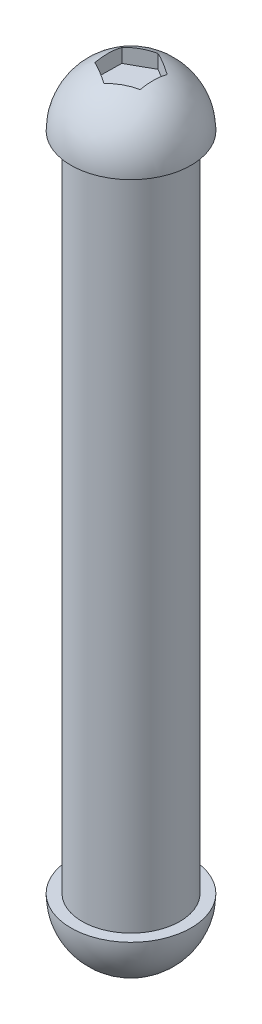
ISO-10303-21;
HEADER;
FILE_DESCRIPTION(('STEP AP214'),'2;1');
FILE_NAME('part.step','',(''),(''),'','','');
FILE_SCHEMA(('AUTOMOTIVE_DESIGN { 1 0 10303 214 1 1 1 1 }'));
ENDSEC;
DATA;
#1=APPLICATION_CONTEXT('core data for automotive mechanical design processes');
#2=APPLICATION_PROTOCOL_DEFINITION('international standard','automotive_design',2000,#1);
#3=PRODUCT_CONTEXT('',#1,'mechanical');
#4=PRODUCT('Part','Part','',(#3));
#5=PRODUCT_RELATED_PRODUCT_CATEGORY('part','',(#4));
#6=PRODUCT_DEFINITION_FORMATION('','',#4);
#7=PRODUCT_DEFINITION_CONTEXT('part definition',#1,'design');
#8=PRODUCT_DEFINITION('design','',#6,#7);
#9=PRODUCT_DEFINITION_SHAPE('','',#8);
#10=(LENGTH_UNIT() NAMED_UNIT(*) SI_UNIT(.MILLI.,.METRE.));
#11=(NAMED_UNIT(*) PLANE_ANGLE_UNIT() SI_UNIT($,.RADIAN.));
#12=(NAMED_UNIT(*) SI_UNIT($,.STERADIAN.) SOLID_ANGLE_UNIT());
#13=UNCERTAINTY_MEASURE_WITH_UNIT(LENGTH_MEASURE(1.E-05),#10,'distance_accuracy_value','');
#14=(GEOMETRIC_REPRESENTATION_CONTEXT(3) GLOBAL_UNCERTAINTY_ASSIGNED_CONTEXT((#13)) GLOBAL_UNIT_ASSIGNED_CONTEXT((#10,
#11,#12)) REPRESENTATION_CONTEXT('',''));
#15=CARTESIAN_POINT('',(0.,0.,0.));
#16=DIRECTION('',(0.,0.,1.));
#17=DIRECTION('',(1.,0.,0.));
#18=AXIS2_PLACEMENT_3D('',#15,#16,#17);
#19=CARTESIAN_POINT('',(0.,0.,0.));
#20=DIRECTION('',(0.0757388786567332,0.,-0.997127686036157));
#21=DIRECTION('',(-0.997127686036157,0.,-0.0757388786567332));
#22=AXIS2_PLACEMENT_3D('',#19,#20,#21);
#23=SPHERICAL_SURFACE('',#22,3.);
#24=CARTESIAN_POINT('',(-0.591036564901015,0.,0.987830611369554));
#25=DIRECTION('',(-0.513433884385675,0.,0.858129154827312));
#26=DIRECTION('',(0.858129154827312,0.,0.513433884385675));
#27=AXIS2_PLACEMENT_3D('',#24,#25,#26);
#28=CIRCLE('',#27,2.77035493433446);
#29=CARTESIAN_POINT('',(-0.0207122955130502,-2.68945259912156,1.32906573121607));
#30=VERTEX_POINT('',#29);
#31=CARTESIAN_POINT('',(-1.16136083428898,-2.68945259912156,0.646595491523041));
#32=VERTEX_POINT('',#31);
#33=EDGE_CURVE('E48',#30,#32,#28,.F.);
#34=ORIENTED_EDGE('',*,*,#33,.F.);
#35=CARTESIAN_POINT('',(0.559968121631439,0.,1.00576798545455));
#36=DIRECTION('',(0.486444705615685,0.,0.873711364455373));
#37=DIRECTION('',(0.873711364455373,0.,-0.486444705615685));
#38=AXIS2_PLACEMENT_3D('',#35,#36,#37);
#39=CIRCLE('',#38,2.77035493433446);
#40=CARTESIAN_POINT('',(1.14064853877593,-2.68945259912156,0.682470239693026));
#41=VERTEX_POINT('',#40);
#42=EDGE_CURVE('E63',#41,#30,#39,.F.);
#43=ORIENTED_EDGE('',*,*,#42,.F.);
#44=CARTESIAN_POINT('',(1.15100468653246,0.,0.0179373740849928));
#45=DIRECTION('',(0.99987859000136,0.,0.0155822096280604));
#46=DIRECTION('',(0.0155822096280604,0.,-0.99987859000136));
#47=AXIS2_PLACEMENT_3D('',#44,#45,#46);
#48=CIRCLE('',#47,2.77035493433446);
#49=CARTESIAN_POINT('',(1.16136083428898,-2.68945259912156,-0.646595491523042));
#50=VERTEX_POINT('',#49);
#51=EDGE_CURVE('E233',#50,#41,#48,.F.);
#52=ORIENTED_EDGE('',*,*,#51,.F.);
#53=CARTESIAN_POINT('',(0.591036564901016,0.,-0.987830611369555));
#54=DIRECTION('',(0.513433884385675,0.,-0.858129154827312));
#55=DIRECTION('',(-0.858129154827312,0.,-0.513433884385675));
#56=AXIS2_PLACEMENT_3D('',#53,#54,#55);
#57=CIRCLE('',#56,2.77035493433446);
#58=CARTESIAN_POINT('',(0.0207122955130501,-2.68945259912156,-1.32906573121607));
#59=VERTEX_POINT('',#58);
#60=EDGE_CURVE('E231',#59,#50,#57,.F.);
#61=ORIENTED_EDGE('',*,*,#60,.F.);
#62=CARTESIAN_POINT('',(-0.559968121631441,0.,-1.00576798545455));
#63=DIRECTION('',(-0.486444705615685,0.,-0.873711364455373));
#64=DIRECTION('',(-0.873711364455373,0.,0.486444705615685));
#65=AXIS2_PLACEMENT_3D('',#62,#63,#64);
#66=CIRCLE('',#65,2.77035493433446);
#67=CARTESIAN_POINT('',(-1.14064853877593,-2.68945259912156,-0.682470239693026));
#68=VERTEX_POINT('',#67);
#69=EDGE_CURVE('E229',#68,#59,#66,.F.);
#70=ORIENTED_EDGE('',*,*,#69,.F.);
#71=CARTESIAN_POINT('',(-1.15100468653246,0.,-0.0179373740849914));
#72=DIRECTION('',(-0.99987859000136,0.,-0.0155822096280607));
#73=DIRECTION('',(-0.0155822096280607,0.,0.99987859000136));
#74=AXIS2_PLACEMENT_3D('',#71,#72,#73);
#75=CIRCLE('',#74,2.77035493433446);
#76=EDGE_CURVE('E227',#32,#68,#75,.F.);
#77=ORIENTED_EDGE('',*,*,#76,.F.);
#78=EDGE_LOOP('',(#34,#43,#52,#61,#70,#77));
#79=FACE_BOUND('',#78,.T.);
#80=CARTESIAN_POINT('',(0.,0.,0.));
#81=DIRECTION('',(0.,-1.,0.));
#82=DIRECTION('',(-0.151042665635923,0.,0.988527244519642));
#83=AXIS2_PLACEMENT_3D('',#80,#81,#82);
#84=CIRCLE('',#83,3.);
#85=CARTESIAN_POINT('',(-0.45312799690777,0.,2.96558173355893));
#86=VERTEX_POINT('',#85);
#87=EDGE_CURVE('E212',#86,#86,#84,.T.);
#88=ORIENTED_EDGE('',*,*,#87,.T.);
#89=EDGE_LOOP('',(#88));
#90=FACE_BOUND('',#89,.T.);
#91=ADVANCED_FACE('F41',(#79,#90),#23,.T.);
#92=CARTESIAN_POINT('',(0.,0.,0.));
#93=DIRECTION('',(0.,-1.,0.));
#94=DIRECTION('',(-0.151042665635923,0.,0.988527244519642));
#95=AXIS2_PLACEMENT_3D('',#92,#93,#94);
#96=PLANE('',#95);
#97=CARTESIAN_POINT('',(0.,0.,0.));
#98=DIRECTION('',(0.,-1.,0.));
#99=DIRECTION('',(1.,0.,0.));
#100=AXIS2_PLACEMENT_3D('',#97,#98,#99);
#101=CIRCLE('',#100,2.44);
#102=CARTESIAN_POINT('',(2.44,0.,0.));
#103=VERTEX_POINT('',#102);
#104=EDGE_CURVE('E11',#103,#103,#101,.F.);
#105=ORIENTED_EDGE('',*,*,#104,.F.);
#106=EDGE_LOOP('',(#105));
#107=FACE_BOUND('',#106,.T.);
#108=ORIENTED_EDGE('',*,*,#87,.F.);
#109=EDGE_LOOP('',(#108));
#110=FACE_BOUND('',#109,.T.);
#111=ADVANCED_FACE('F268',(#107,#110),#96,.F.);
#112=CARTESIAN_POINT('',(-0.0207122955130502,-2.,1.32906573121607));
#113=DIRECTION('',(-0.513433884385675,0.,0.858129154827312));
#114=DIRECTION('',(0.858129154827312,0.,0.513433884385675));
#115=AXIS2_PLACEMENT_3D('',#112,#113,#114);
#116=PLANE('',#115);
#117=ORIENTED_EDGE('',*,*,#33,.T.);
#118=DIRECTION('',(0.,-1.,0.));
#119=VECTOR('',#118,1.);
#120=CARTESIAN_POINT('',(-1.16136083428898,-2.,0.646595491523041));
#121=LINE('',#120,#119);
#122=CARTESIAN_POINT('',(-1.16136083428898,-2.,0.646595491523041));
#123=VERTEX_POINT('',#122);
#124=EDGE_CURVE('E55',#123,#32,#121,.T.);
#125=ORIENTED_EDGE('',*,*,#124,.F.);
#126=DIRECTION('',(-0.858129154827312,0.,-0.513433884385675));
#127=VECTOR('',#126,1.);
#128=CARTESIAN_POINT('',(-0.0207122955130502,-2.,1.32906573121607));
#129=LINE('',#128,#127);
#130=CARTESIAN_POINT('',(-0.0207122955130502,-2.,1.32906573121607));
#131=VERTEX_POINT('',#130);
#132=EDGE_CURVE('E192',#131,#123,#129,.T.);
#133=ORIENTED_EDGE('',*,*,#132,.F.);
#134=DIRECTION('',(0.,-1.,0.));
#135=VECTOR('',#134,1.);
#136=CARTESIAN_POINT('',(-0.0207122955130502,-2.,1.32906573121607));
#137=LINE('',#136,#135);
#138=EDGE_CURVE('E210',#131,#30,#137,.T.);
#139=ORIENTED_EDGE('',*,*,#138,.T.);
#140=EDGE_LOOP('',(#117,#125,#133,#139));
#141=FACE_BOUND('',#140,.T.);
#142=ADVANCED_FACE('F238',(#141),#116,.F.);
#143=CARTESIAN_POINT('',(1.14064853877593,-2.,0.682470239693025));
#144=DIRECTION('',(0.486444705615685,0.,0.873711364455373));
#145=DIRECTION('',(0.873711364455373,0.,-0.486444705615685));
#146=AXIS2_PLACEMENT_3D('',#143,#144,#145);
#147=PLANE('',#146);
#148=ORIENTED_EDGE('',*,*,#42,.T.);
#149=ORIENTED_EDGE('',*,*,#138,.F.);
#150=DIRECTION('',(-0.873711364455373,0.,0.486444705615685));
#151=VECTOR('',#150,1.);
#152=CARTESIAN_POINT('',(1.14064853877593,-2.,0.682470239693025));
#153=LINE('',#152,#151);
#154=CARTESIAN_POINT('',(1.14064853877593,-2.,0.682470239693025));
#155=VERTEX_POINT('',#154);
#156=EDGE_CURVE('E207',#155,#131,#153,.T.);
#157=ORIENTED_EDGE('',*,*,#156,.F.);
#158=DIRECTION('',(0.,-1.,0.));
#159=VECTOR('',#158,1.);
#160=CARTESIAN_POINT('',(1.14064853877593,-2.,0.682470239693025));
#161=LINE('',#160,#159);
#162=EDGE_CURVE('E213',#155,#41,#161,.T.);
#163=ORIENTED_EDGE('',*,*,#162,.T.);
#164=EDGE_LOOP('',(#148,#149,#157,#163));
#165=FACE_BOUND('',#164,.T.);
#166=ADVANCED_FACE('F253',(#165),#147,.F.);
#167=CARTESIAN_POINT('',(1.16136083428898,-2.,-0.646595491523042));
#168=DIRECTION('',(0.99987859000136,0.,0.0155822096280604));
#169=DIRECTION('',(0.0155822096280604,0.,-0.99987859000136));
#170=AXIS2_PLACEMENT_3D('',#167,#168,#169);
#171=PLANE('',#170);
#172=ORIENTED_EDGE('',*,*,#51,.T.);
#173=ORIENTED_EDGE('',*,*,#162,.F.);
#174=DIRECTION('',(-0.0155822096280604,0.,0.99987859000136));
#175=VECTOR('',#174,1.);
#176=CARTESIAN_POINT('',(1.16136083428898,-2.,-0.646595491523042));
#177=LINE('',#176,#175);
#178=CARTESIAN_POINT('',(1.16136083428898,-2.,-0.646595491523042));
#179=VERTEX_POINT('',#178);
#180=EDGE_CURVE('E204',#179,#155,#177,.T.);
#181=ORIENTED_EDGE('',*,*,#180,.F.);
#182=DIRECTION('',(0.,-1.,0.));
#183=VECTOR('',#182,1.);
#184=CARTESIAN_POINT('',(1.16136083428898,-2.,-0.646595491523042));
#185=LINE('',#184,#183);
#186=EDGE_CURVE('E215',#179,#50,#185,.T.);
#187=ORIENTED_EDGE('',*,*,#186,.T.);
#188=EDGE_LOOP('',(#172,#173,#181,#187));
#189=FACE_BOUND('',#188,.T.);
#190=ADVANCED_FACE('F256',(#189),#171,.F.);
#191=CARTESIAN_POINT('',(0.0207122955130502,-2.,-1.32906573121607));
#192=DIRECTION('',(0.513433884385675,0.,-0.858129154827312));
#193=DIRECTION('',(-0.858129154827312,0.,-0.513433884385675));
#194=AXIS2_PLACEMENT_3D('',#191,#192,#193);
#195=PLANE('',#194);
#196=ORIENTED_EDGE('',*,*,#60,.T.);
#197=ORIENTED_EDGE('',*,*,#186,.F.);
#198=DIRECTION('',(0.858129154827312,0.,0.513433884385675));
#199=VECTOR('',#198,1.);
#200=CARTESIAN_POINT('',(0.0207122955130502,-2.,-1.32906573121607));
#201=LINE('',#200,#199);
#202=CARTESIAN_POINT('',(0.0207122955130502,-2.,-1.32906573121607));
#203=VERTEX_POINT('',#202);
#204=EDGE_CURVE('E201',#203,#179,#201,.T.);
#205=ORIENTED_EDGE('',*,*,#204,.F.);
#206=DIRECTION('',(0.,-1.,0.));
#207=VECTOR('',#206,1.);
#208=CARTESIAN_POINT('',(0.0207122955130502,-2.,-1.32906573121607));
#209=LINE('',#208,#207);
#210=EDGE_CURVE('E218',#203,#59,#209,.T.);
#211=ORIENTED_EDGE('',*,*,#210,.T.);
#212=EDGE_LOOP('',(#196,#197,#205,#211));
#213=FACE_BOUND('',#212,.T.);
#214=ADVANCED_FACE('F258',(#213),#195,.F.);
#215=CARTESIAN_POINT('',(-1.14064853877593,-2.,-0.682470239693026));
#216=DIRECTION('',(-0.486444705615685,0.,-0.873711364455373));
#217=DIRECTION('',(-0.873711364455373,0.,0.486444705615685));
#218=AXIS2_PLACEMENT_3D('',#215,#216,#217);
#219=PLANE('',#218);
#220=ORIENTED_EDGE('',*,*,#69,.T.);
#221=ORIENTED_EDGE('',*,*,#210,.F.);
#222=DIRECTION('',(0.873711364455373,0.,-0.486444705615685));
#223=VECTOR('',#222,1.);
#224=CARTESIAN_POINT('',(-1.14064853877593,-2.,-0.682470239693026));
#225=LINE('',#224,#223);
#226=CARTESIAN_POINT('',(-1.14064853877593,-2.,-0.682470239693026));
#227=VERTEX_POINT('',#226);
#228=EDGE_CURVE('E198',#227,#203,#225,.T.);
#229=ORIENTED_EDGE('',*,*,#228,.F.);
#230=DIRECTION('',(0.,-1.,0.));
#231=VECTOR('',#230,1.);
#232=CARTESIAN_POINT('',(-1.14064853877593,-2.,-0.682470239693026));
#233=LINE('',#232,#231);
#234=EDGE_CURVE('E221',#227,#68,#233,.T.);
#235=ORIENTED_EDGE('',*,*,#234,.T.);
#236=EDGE_LOOP('',(#220,#221,#229,#235));
#237=FACE_BOUND('',#236,.T.);
#238=ADVANCED_FACE('F247',(#237),#219,.F.);
#239=CARTESIAN_POINT('',(-1.16136083428898,-2.,0.646595491523041));
#240=DIRECTION('',(-0.99987859000136,0.,-0.0155822096280607));
#241=DIRECTION('',(-0.0155822096280607,0.,0.99987859000136));
#242=AXIS2_PLACEMENT_3D('',#239,#240,#241);
#243=PLANE('',#242);
#244=ORIENTED_EDGE('',*,*,#76,.T.);
#245=ORIENTED_EDGE('',*,*,#234,.F.);
#246=DIRECTION('',(0.0155822096280607,0.,-0.99987859000136));
#247=VECTOR('',#246,1.);
#248=CARTESIAN_POINT('',(-1.16136083428898,-2.,0.646595491523041));
#249=LINE('',#248,#247);
#250=EDGE_CURVE('E195',#123,#227,#249,.T.);
#251=ORIENTED_EDGE('',*,*,#250,.F.);
#252=ORIENTED_EDGE('',*,*,#124,.T.);
#253=EDGE_LOOP('',(#244,#245,#251,#252));
#254=FACE_BOUND('',#253,.T.);
#255=ADVANCED_FACE('F244',(#254),#243,.F.);
#256=CARTESIAN_POINT('',(0.,-2.,0.));
#257=DIRECTION('',(0.,-1.,0.));
#258=DIRECTION('',(0.,0.,-1.));
#259=AXIS2_PLACEMENT_3D('',#256,#257,#258);
#260=PLANE('',#259);
#261=ORIENTED_EDGE('',*,*,#132,.T.);
#262=ORIENTED_EDGE('',*,*,#250,.T.);
#263=ORIENTED_EDGE('',*,*,#228,.T.);
#264=ORIENTED_EDGE('',*,*,#204,.T.);
#265=ORIENTED_EDGE('',*,*,#180,.T.);
#266=ORIENTED_EDGE('',*,*,#156,.T.);
#267=EDGE_LOOP('',(#261,#262,#263,#264,#265,#266));
#268=FACE_BOUND('',#267,.T.);
#269=ADVANCED_FACE('F250',(#268),#260,.T.);
#270=CARTESIAN_POINT('',(-1.1488793937189E-13,16.5,0.));
#271=DIRECTION('',(0.,-1.,0.));
#272=DIRECTION('',(1.,0.,0.));
#273=AXIS2_PLACEMENT_3D('',#270,#271,#272);
#274=CYLINDRICAL_SURFACE('',#273,2.44);
#275=ORIENTED_EDGE('',*,*,#104,.T.);
#276=EDGE_LOOP('',(#275));
#277=FACE_BOUND('',#276,.T.);
#278=CARTESIAN_POINT('',(-2.29775878743779E-13,33.,0.));
#279=DIRECTION('',(0.,-1.,0.));
#280=DIRECTION('',(1.,0.,0.));
#281=AXIS2_PLACEMENT_3D('',#278,#279,#280);
#282=CIRCLE('',#281,2.44);
#283=CARTESIAN_POINT('',(2.43999999999977,33.,0.));
#284=VERTEX_POINT('',#283);
#285=EDGE_CURVE('E189',#284,#284,#282,.F.);
#286=ORIENTED_EDGE('',*,*,#285,.F.);
#287=EDGE_LOOP('',(#286));
#288=FACE_BOUND('',#287,.T.);
#289=ADVANCED_FACE('F284',(#277,#288),#274,.T.);
#290=CARTESIAN_POINT('',(-2.29884298961028E-13,33.,0.));
#291=DIRECTION('',(0.0757388786567332,0.,-0.997127686036157));
#292=DIRECTION('',(-0.997127686036157,0.,-0.0757388786567332));
#293=AXIS2_PLACEMENT_3D('',#290,#291,#292);
#294=SPHERICAL_SURFACE('',#293,3.);
#295=CARTESIAN_POINT('',(-0.591036564901245,33.,0.987830611369537));
#296=DIRECTION('',(0.513433884385675,0.,-0.858129154827312));
#297=DIRECTION('',(0.858129154827312,0.,0.513433884385675));
#298=AXIS2_PLACEMENT_3D('',#295,#296,#297);
#299=CIRCLE('',#298,2.77035493433446);
#300=CARTESIAN_POINT('',(-0.0207122955133174,35.6894525991216,1.32906573121605));
#301=VERTEX_POINT('',#300);
#302=CARTESIAN_POINT('',(-1.16136083428925,35.6894525991215,0.646595491523021));
#303=VERTEX_POINT('',#302);
#304=EDGE_CURVE('E187',#301,#303,#299,.F.);
#305=ORIENTED_EDGE('',*,*,#304,.T.);
#306=CARTESIAN_POINT('',(-1.15100468653269,33.,-0.0179373740850089));
#307=DIRECTION('',(0.99987859000136,0.,0.0155822096280607));
#308=DIRECTION('',(-0.0155822096280607,0.,0.99987859000136));
#309=AXIS2_PLACEMENT_3D('',#306,#307,#308);
#310=CIRCLE('',#309,2.77035493433446);
#311=CARTESIAN_POINT('',(-1.1406485387762,35.6894525991215,-0.682470239693047));
#312=VERTEX_POINT('',#311);
#313=EDGE_CURVE('E146',#303,#312,#310,.F.);
#314=ORIENTED_EDGE('',*,*,#313,.T.);
#315=CARTESIAN_POINT('',(-0.559968121631671,33.,-1.00576798545456));
#316=DIRECTION('',(0.486444705615685,0.,0.873711364455373));
#317=DIRECTION('',(-0.873711364455373,0.,0.486444705615685));
#318=AXIS2_PLACEMENT_3D('',#315,#316,#317);
#319=CIRCLE('',#318,2.77035493433446);
#320=CARTESIAN_POINT('',(0.0207122955127829,35.6894525991216,-1.32906573121609));
#321=VERTEX_POINT('',#320);
#322=EDGE_CURVE('E175',#312,#321,#319,.F.);
#323=ORIENTED_EDGE('',*,*,#322,.T.);
#324=CARTESIAN_POINT('',(0.591036564900786,33.,-0.987830611369572));
#325=DIRECTION('',(-0.513433884385675,0.,0.858129154827312));
#326=DIRECTION('',(-0.858129154827312,0.,-0.513433884385675));
#327=AXIS2_PLACEMENT_3D('',#324,#325,#326);
#328=CIRCLE('',#327,2.77035493433446);
#329=CARTESIAN_POINT('',(1.16136083428871,35.6894525991216,-0.646595491523062));
#330=VERTEX_POINT('',#329);
#331=EDGE_CURVE('E178',#321,#330,#328,.F.);
#332=ORIENTED_EDGE('',*,*,#331,.T.);
#333=CARTESIAN_POINT('',(1.15100468653223,33.,0.0179373740849753));
#334=DIRECTION('',(-0.99987859000136,0.,-0.0155822096280604));
#335=DIRECTION('',(0.0155822096280604,0.,-0.99987859000136));
#336=AXIS2_PLACEMENT_3D('',#333,#334,#335);
#337=CIRCLE('',#336,2.77035493433446);
#338=CARTESIAN_POINT('',(1.14064853877566,35.6894525991216,0.682470239693005));
#339=VERTEX_POINT('',#338);
#340=EDGE_CURVE('E181',#330,#339,#337,.F.);
#341=ORIENTED_EDGE('',*,*,#340,.T.);
#342=CARTESIAN_POINT('',(0.55996812163121,33.,1.00576798545453));
#343=DIRECTION('',(-0.486444705615685,0.,-0.873711364455373));
#344=DIRECTION('',(0.873711364455373,0.,-0.486444705615685));
#345=AXIS2_PLACEMENT_3D('',#342,#343,#344);
#346=CIRCLE('',#345,2.77035493433446);
#347=EDGE_CURVE('E184',#339,#301,#346,.F.);
#348=ORIENTED_EDGE('',*,*,#347,.T.);
#349=EDGE_LOOP('',(#305,#314,#323,#332,#341,#348));
#350=FACE_BOUND('',#349,.T.);
#351=CARTESIAN_POINT('',(-2.29884298961028E-13,33.,0.));
#352=DIRECTION('',(0.,-1.,0.));
#353=DIRECTION('',(-0.151042665635923,0.,0.988527244519642));
#354=AXIS2_PLACEMENT_3D('',#351,#352,#353);
#355=CIRCLE('',#354,3.);
#356=CARTESIAN_POINT('',(-0.453127996908,33.,2.96558173355891));
#357=VERTEX_POINT('',#356);
#358=EDGE_CURVE('E164',#357,#357,#355,.T.);
#359=ORIENTED_EDGE('',*,*,#358,.F.);
#360=EDGE_LOOP('',(#359));
#361=FACE_BOUND('',#360,.T.);
#362=ADVANCED_FACE('F289',(#350,#361),#294,.T.);
#363=CARTESIAN_POINT('',(-2.29884298961028E-13,33.,0.));
#364=DIRECTION('',(0.,1.,0.));
#365=DIRECTION('',(-0.151042665635923,0.,0.988527244519642));
#366=AXIS2_PLACEMENT_3D('',#363,#364,#365);
#367=PLANE('',#366);
#368=ORIENTED_EDGE('',*,*,#285,.T.);
#369=EDGE_LOOP('',(#368));
#370=FACE_BOUND('',#369,.T.);
#371=ORIENTED_EDGE('',*,*,#358,.T.);
#372=EDGE_LOOP('',(#371));
#373=FACE_BOUND('',#372,.T.);
#374=ADVANCED_FACE('F356',(#370,#373),#367,.F.);
#375=CARTESIAN_POINT('',(-0.0207122955133078,35.,1.32906573121605));
#376=DIRECTION('',(-0.513433884385675,0.,0.858129154827312));
#377=DIRECTION('',(0.858129154827312,0.,0.513433884385675));
#378=AXIS2_PLACEMENT_3D('',#375,#376,#377);
#379=PLANE('',#378);
#380=ORIENTED_EDGE('',*,*,#304,.F.);
#381=DIRECTION('',(0.,1.,0.));
#382=VECTOR('',#381,1.);
#383=CARTESIAN_POINT('',(-0.0207122955133078,35.,1.32906573121605));
#384=LINE('',#383,#382);
#385=CARTESIAN_POINT('',(-0.0207122955133078,35.,1.32906573121605));
#386=VERTEX_POINT('',#385);
#387=EDGE_CURVE('E154',#386,#301,#384,.T.);
#388=ORIENTED_EDGE('',*,*,#387,.F.);
#389=DIRECTION('',(-0.858129154827312,0.,-0.513433884385675));
#390=VECTOR('',#389,1.);
#391=CARTESIAN_POINT('',(-0.0207122955133078,35.,1.32906573121605));
#392=LINE('',#391,#390);
#393=CARTESIAN_POINT('',(-1.16136083428924,35.,0.646595491523021));
#394=VERTEX_POINT('',#393);
#395=EDGE_CURVE('E135',#386,#394,#392,.T.);
#396=ORIENTED_EDGE('',*,*,#395,.T.);
#397=DIRECTION('',(0.,1.,0.));
#398=VECTOR('',#397,1.);
#399=CARTESIAN_POINT('',(-1.16136083428924,35.,0.646595491523021));
#400=LINE('',#399,#398);
#401=EDGE_CURVE('E143',#394,#303,#400,.T.);
#402=ORIENTED_EDGE('',*,*,#401,.T.);
#403=EDGE_LOOP('',(#380,#388,#396,#402));
#404=FACE_BOUND('',#403,.T.);
#405=ADVANCED_FACE('F153',(#404),#379,.F.);
#406=CARTESIAN_POINT('',(1.14064853877567,35.,0.682470239693006));
#407=DIRECTION('',(0.486444705615685,0.,0.873711364455373));
#408=DIRECTION('',(0.873711364455373,0.,-0.486444705615685));
#409=AXIS2_PLACEMENT_3D('',#406,#407,#408);
#410=PLANE('',#409);
#411=ORIENTED_EDGE('',*,*,#347,.F.);
#412=DIRECTION('',(0.,1.,0.));
#413=VECTOR('',#412,1.);
#414=CARTESIAN_POINT('',(1.14064853877567,35.,0.682470239693006));
#415=LINE('',#414,#413);
#416=CARTESIAN_POINT('',(1.14064853877567,35.,0.682470239693006));
#417=VERTEX_POINT('',#416);
#418=EDGE_CURVE('E165',#417,#339,#415,.T.);
#419=ORIENTED_EDGE('',*,*,#418,.F.);
#420=DIRECTION('',(-0.873711364455373,0.,0.486444705615685));
#421=VECTOR('',#420,1.);
#422=CARTESIAN_POINT('',(1.14064853877567,35.,0.682470239693006));
#423=LINE('',#422,#421);
#424=EDGE_CURVE('E151',#417,#386,#423,.T.);
#425=ORIENTED_EDGE('',*,*,#424,.T.);
#426=ORIENTED_EDGE('',*,*,#387,.T.);
#427=EDGE_LOOP('',(#411,#419,#425,#426));
#428=FACE_BOUND('',#427,.T.);
#429=ADVANCED_FACE('F379',(#428),#410,.F.);
#430=CARTESIAN_POINT('',(1.16136083428872,35.,-0.646595491523062));
#431=DIRECTION('',(0.99987859000136,0.,0.0155822096280604));
#432=DIRECTION('',(0.0155822096280604,0.,-0.99987859000136));
#433=AXIS2_PLACEMENT_3D('',#430,#431,#432);
#434=PLANE('',#433);
#435=ORIENTED_EDGE('',*,*,#340,.F.);
#436=DIRECTION('',(0.,1.,0.));
#437=VECTOR('',#436,1.);
#438=CARTESIAN_POINT('',(1.16136083428872,35.,-0.646595491523062));
#439=LINE('',#438,#437);
#440=CARTESIAN_POINT('',(1.16136083428872,35.,-0.646595491523062));
#441=VERTEX_POINT('',#440);
#442=EDGE_CURVE('E167',#441,#330,#439,.T.);
#443=ORIENTED_EDGE('',*,*,#442,.F.);
#444=DIRECTION('',(-0.0155822096280604,0.,0.99987859000136));
#445=VECTOR('',#444,1.);
#446=CARTESIAN_POINT('',(1.16136083428872,35.,-0.646595491523062));
#447=LINE('',#446,#445);
#448=EDGE_CURVE('E160',#441,#417,#447,.T.);
#449=ORIENTED_EDGE('',*,*,#448,.T.);
#450=ORIENTED_EDGE('',*,*,#418,.T.);
#451=EDGE_LOOP('',(#435,#443,#449,#450));
#452=FACE_BOUND('',#451,.T.);
#453=ADVANCED_FACE('F389',(#452),#434,.F.);
#454=CARTESIAN_POINT('',(0.0207122955127926,35.,-1.32906573121609));
#455=DIRECTION('',(0.513433884385675,0.,-0.858129154827312));
#456=DIRECTION('',(-0.858129154827312,0.,-0.513433884385675));
#457=AXIS2_PLACEMENT_3D('',#454,#455,#456);
#458=PLANE('',#457);
#459=ORIENTED_EDGE('',*,*,#331,.F.);
#460=DIRECTION('',(0.,1.,0.));
#461=VECTOR('',#460,1.);
#462=CARTESIAN_POINT('',(0.0207122955127926,35.,-1.32906573121609));
#463=LINE('',#462,#461);
#464=CARTESIAN_POINT('',(0.0207122955127926,35.,-1.32906573121609));
#465=VERTEX_POINT('',#464);
#466=EDGE_CURVE('E169',#465,#321,#463,.T.);
#467=ORIENTED_EDGE('',*,*,#466,.F.);
#468=DIRECTION('',(0.858129154827312,0.,0.513433884385675));
#469=VECTOR('',#468,1.);
#470=CARTESIAN_POINT('',(0.0207122955127926,35.,-1.32906573121609));
#471=LINE('',#470,#469);
#472=EDGE_CURVE('E158',#465,#441,#471,.T.);
#473=ORIENTED_EDGE('',*,*,#472,.T.);
#474=ORIENTED_EDGE('',*,*,#442,.T.);
#475=EDGE_LOOP('',(#459,#467,#473,#474));
#476=FACE_BOUND('',#475,.T.);
#477=ADVANCED_FACE('F400',(#476),#458,.F.);
#478=CARTESIAN_POINT('',(-1.14064853877619,35.,-0.682470239693046));
#479=DIRECTION('',(-0.486444705615685,0.,-0.873711364455373));
#480=DIRECTION('',(-0.873711364455373,0.,0.486444705615685));
#481=AXIS2_PLACEMENT_3D('',#478,#479,#480);
#482=PLANE('',#481);
#483=ORIENTED_EDGE('',*,*,#322,.F.);
#484=DIRECTION('',(0.,1.,0.));
#485=VECTOR('',#484,1.);
#486=CARTESIAN_POINT('',(-1.14064853877619,35.,-0.682470239693046));
#487=LINE('',#486,#485);
#488=CARTESIAN_POINT('',(-1.14064853877619,35.,-0.682470239693046));
#489=VERTEX_POINT('',#488);
#490=EDGE_CURVE('E150',#489,#312,#487,.T.);
#491=ORIENTED_EDGE('',*,*,#490,.F.);
#492=DIRECTION('',(0.873711364455373,0.,-0.486444705615685));
#493=VECTOR('',#492,1.);
#494=CARTESIAN_POINT('',(-1.14064853877619,35.,-0.682470239693046));
#495=LINE('',#494,#493);
#496=EDGE_CURVE('E138',#489,#465,#495,.T.);
#497=ORIENTED_EDGE('',*,*,#496,.T.);
#498=ORIENTED_EDGE('',*,*,#466,.T.);
#499=EDGE_LOOP('',(#483,#491,#497,#498));
#500=FACE_BOUND('',#499,.T.);
#501=ADVANCED_FACE('F411',(#500),#482,.F.);
#502=CARTESIAN_POINT('',(-1.16136083428924,35.,0.646595491523021));
#503=DIRECTION('',(-0.99987859000136,0.,-0.0155822096280607));
#504=DIRECTION('',(-0.0155822096280607,0.,0.99987859000136));
#505=AXIS2_PLACEMENT_3D('',#502,#503,#504);
#506=PLANE('',#505);
#507=ORIENTED_EDGE('',*,*,#313,.F.);
#508=ORIENTED_EDGE('',*,*,#401,.F.);
#509=DIRECTION('',(0.0155822096280607,0.,-0.99987859000136));
#510=VECTOR('',#509,1.);
#511=CARTESIAN_POINT('',(-1.16136083428924,35.,0.646595491523021));
#512=LINE('',#511,#510);
#513=EDGE_CURVE('E130',#394,#489,#512,.T.);
#514=ORIENTED_EDGE('',*,*,#513,.T.);
#515=ORIENTED_EDGE('',*,*,#490,.T.);
#516=EDGE_LOOP('',(#507,#508,#514,#515));
#517=FACE_BOUND('',#516,.T.);
#518=ADVANCED_FACE('F144',(#517),#506,.F.);
#519=CARTESIAN_POINT('',(-2.57627500409692E-13,35.,0.));
#520=DIRECTION('',(0.,1.,0.));
#521=DIRECTION('',(0.,0.,-1.));
#522=AXIS2_PLACEMENT_3D('',#519,#520,#521);
#523=PLANE('',#522);
#524=ORIENTED_EDGE('',*,*,#395,.F.);
#525=ORIENTED_EDGE('',*,*,#424,.F.);
#526=ORIENTED_EDGE('',*,*,#448,.F.);
#527=ORIENTED_EDGE('',*,*,#472,.F.);
#528=ORIENTED_EDGE('',*,*,#496,.F.);
#529=ORIENTED_EDGE('',*,*,#513,.F.);
#530=EDGE_LOOP('',(#524,#525,#526,#527,#528,#529));
#531=FACE_BOUND('',#530,.T.);
#532=ADVANCED_FACE('F132',(#531),#523,.T.);
#533=CLOSED_SHELL('',(#91,#111,#142,#166,#190,#214,#238,#255,#269,#289,#362,#374,#405,#429,#453,
#477,#501,#518,#532));
#534=MANIFOLD_SOLID_BREP('B2',#533);
#535=ADVANCED_BREP_SHAPE_REPRESENTATION('',(#18,#534),#14);
#536=SHAPE_DEFINITION_REPRESENTATION(#9,#535);
ENDSEC;
END-ISO-10303-21;
